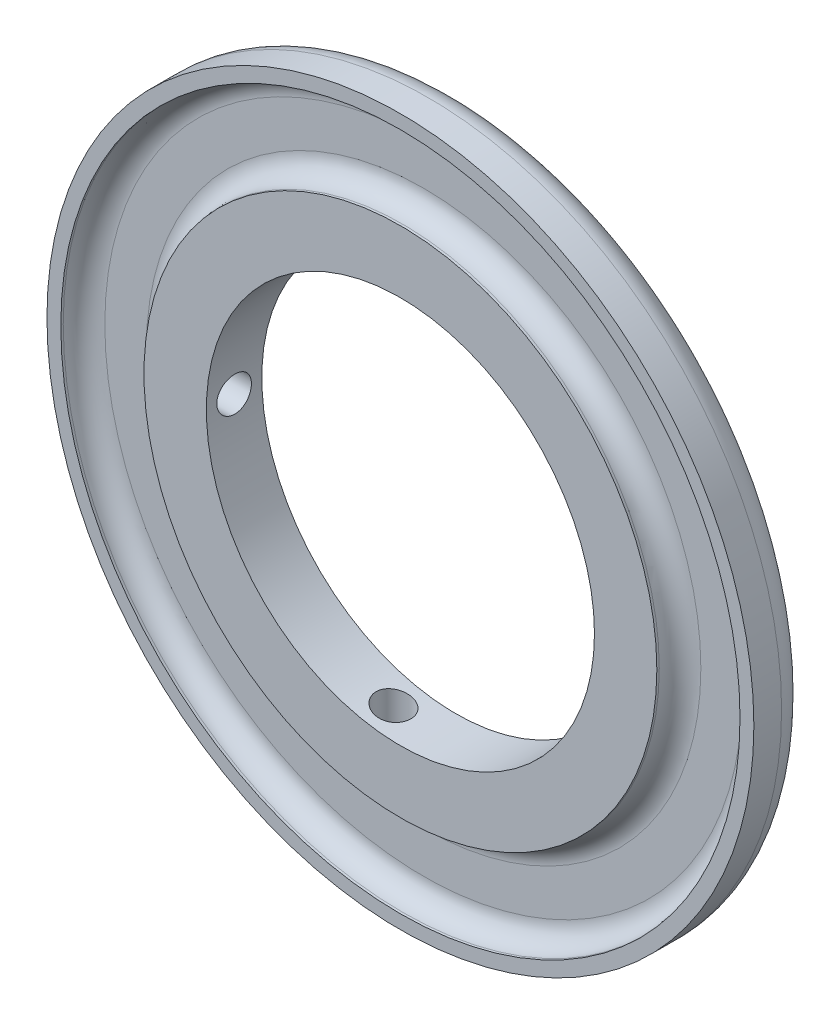
ISO-10303-21;
HEADER;
FILE_DESCRIPTION(('STEP AP214'),'2;1');
FILE_NAME('part.step','',(''),(''),'','','');
FILE_SCHEMA(('AUTOMOTIVE_DESIGN { 1 0 10303 214 1 1 1 1 }'));
ENDSEC;
DATA;
#1=APPLICATION_CONTEXT('core data for automotive mechanical design processes');
#2=APPLICATION_PROTOCOL_DEFINITION('international standard','automotive_design',2000,#1);
#3=PRODUCT_CONTEXT('',#1,'mechanical');
#4=PRODUCT('Part','Part','',(#3));
#5=PRODUCT_RELATED_PRODUCT_CATEGORY('part','',(#4));
#6=PRODUCT_DEFINITION_FORMATION('','',#4);
#7=PRODUCT_DEFINITION_CONTEXT('part definition',#1,'design');
#8=PRODUCT_DEFINITION('design','',#6,#7);
#9=PRODUCT_DEFINITION_SHAPE('','',#8);
#10=(LENGTH_UNIT() NAMED_UNIT(*) SI_UNIT(.MILLI.,.METRE.));
#11=(NAMED_UNIT(*) PLANE_ANGLE_UNIT() SI_UNIT($,.RADIAN.));
#12=(NAMED_UNIT(*) SI_UNIT($,.STERADIAN.) SOLID_ANGLE_UNIT());
#13=UNCERTAINTY_MEASURE_WITH_UNIT(LENGTH_MEASURE(1.E-05),#10,'distance_accuracy_value','');
#14=(GEOMETRIC_REPRESENTATION_CONTEXT(3) GLOBAL_UNCERTAINTY_ASSIGNED_CONTEXT((#13)) GLOBAL_UNIT_ASSIGNED_CONTEXT((#10,
#11,#12)) REPRESENTATION_CONTEXT('',''));
#15=CARTESIAN_POINT('',(0.,0.,0.));
#16=DIRECTION('',(0.,0.,1.));
#17=DIRECTION('',(1.,0.,0.));
#18=AXIS2_PLACEMENT_3D('',#15,#16,#17);
#19=CARTESIAN_POINT('',(0.,0.,4.));
#20=DIRECTION('',(0.,0.,-1.));
#21=DIRECTION('',(-1.,0.,0.));
#22=AXIS2_PLACEMENT_3D('',#19,#20,#21);
#23=CYLINDRICAL_SURFACE('',#22,25.5);
#24=CARTESIAN_POINT('',(0.,0.,2.));
#25=DIRECTION('',(0.,0.,1.));
#26=DIRECTION('',(1.,0.,0.));
#27=AXIS2_PLACEMENT_3D('',#24,#25,#26);
#28=CIRCLE('',#27,25.5);
#29=CARTESIAN_POINT('',(25.5,0.,2.));
#30=VERTEX_POINT('',#29);
#31=EDGE_CURVE('E45',#30,#30,#28,.T.);
#32=ORIENTED_EDGE('',*,*,#31,.T.);
#33=EDGE_LOOP('',(#32));
#34=FACE_BOUND('',#33,.T.);
#35=CARTESIAN_POINT('',(0.,0.,4.));
#36=DIRECTION('',(0.,0.,1.));
#37=DIRECTION('',(1.,0.,0.));
#38=AXIS2_PLACEMENT_3D('',#35,#36,#37);
#39=CIRCLE('',#38,25.5);
#40=CARTESIAN_POINT('',(25.5,0.,4.));
#41=VERTEX_POINT('',#40);
#42=EDGE_CURVE('E131',#41,#41,#39,.T.);
#43=ORIENTED_EDGE('',*,*,#42,.F.);
#44=EDGE_LOOP('',(#43));
#45=FACE_BOUND('',#44,.T.);
#46=ADVANCED_FACE('F32',(#34,#45),#23,.T.);
#47=CARTESIAN_POINT('',(0.,0.,4.));
#48=DIRECTION('',(0.,0.,1.));
#49=DIRECTION('',(1.,0.,0.));
#50=AXIS2_PLACEMENT_3D('',#47,#48,#49);
#51=PLANE('',#50);
#52=CARTESIAN_POINT('',(0.,0.,4.));
#53=DIRECTION('',(0.,0.,1.));
#54=DIRECTION('',(1.,0.,0.));
#55=AXIS2_PLACEMENT_3D('',#52,#53,#54);
#56=CIRCLE('',#55,24.5);
#57=CARTESIAN_POINT('',(24.5,0.,4.));
#58=VERTEX_POINT('',#57);
#59=EDGE_CURVE('E142',#58,#58,#56,.T.);
#60=ORIENTED_EDGE('',*,*,#59,.F.);
#61=EDGE_LOOP('',(#60));
#62=FACE_BOUND('',#61,.T.);
#63=ORIENTED_EDGE('',*,*,#42,.T.);
#64=EDGE_LOOP('',(#63));
#65=FACE_BOUND('',#64,.T.);
#66=ADVANCED_FACE('F95',(#62,#65),#51,.T.);
#67=CARTESIAN_POINT('',(0.,0.,0.));
#68=DIRECTION('',(0.,0.,1.));
#69=DIRECTION('',(1.,0.,0.));
#70=AXIS2_PLACEMENT_3D('',#67,#68,#69);
#71=PLANE('',#70);
#72=CARTESIAN_POINT('',(0.,0.,0.));
#73=DIRECTION('',(0.,0.,1.));
#74=DIRECTION('',(1.,0.,0.));
#75=AXIS2_PLACEMENT_3D('',#72,#73,#74);
#76=CIRCLE('',#75,23.5);
#77=CARTESIAN_POINT('',(23.5,0.,0.));
#78=VERTEX_POINT('',#77);
#79=EDGE_CURVE('E10',#78,#78,#76,.F.);
#80=ORIENTED_EDGE('',*,*,#79,.T.);
#81=EDGE_LOOP('',(#80));
#82=FACE_BOUND('',#81,.T.);
#83=CARTESIAN_POINT('',(0.,0.,0.));
#84=DIRECTION('',(0.,0.,1.));
#85=DIRECTION('',(1.,0.,0.));
#86=AXIS2_PLACEMENT_3D('',#83,#84,#85);
#87=CIRCLE('',#86,14.);
#88=CARTESIAN_POINT('',(14.,0.,0.));
#89=VERTEX_POINT('',#88);
#90=EDGE_CURVE('E147',#89,#89,#87,.T.);
#91=ORIENTED_EDGE('',*,*,#90,.T.);
#92=EDGE_LOOP('',(#91));
#93=FACE_BOUND('',#92,.T.);
#94=ADVANCED_FACE('F101',(#82,#93),#71,.F.);
#95=CARTESIAN_POINT('',(0.,0.,2.325));
#96=DIRECTION('',(0.,0.,1.));
#97=DIRECTION('',(1.,0.,0.));
#98=AXIS2_PLACEMENT_3D('',#95,#96,#97);
#99=CYLINDRICAL_SURFACE('',#98,24.5);
#100=CARTESIAN_POINT('',(0.,0.,3.825));
#101=DIRECTION('',(0.,0.,1.));
#102=DIRECTION('',(1.,0.,0.));
#103=AXIS2_PLACEMENT_3D('',#100,#101,#102);
#104=CIRCLE('',#103,24.5);
#105=CARTESIAN_POINT('',(24.5,0.,3.825));
#106=VERTEX_POINT('',#105);
#107=EDGE_CURVE('E50',#106,#106,#104,.F.);
#108=ORIENTED_EDGE('',*,*,#107,.T.);
#109=EDGE_LOOP('',(#108));
#110=FACE_BOUND('',#109,.T.);
#111=ORIENTED_EDGE('',*,*,#59,.T.);
#112=EDGE_LOOP('',(#111));
#113=FACE_BOUND('',#112,.T.);
#114=ADVANCED_FACE('F135',(#110,#113),#99,.F.);
#115=CARTESIAN_POINT('',(0.,0.,2.325));
#116=DIRECTION('',(0.,0.,1.));
#117=DIRECTION('',(1.,0.,0.));
#118=AXIS2_PLACEMENT_3D('',#115,#116,#117);
#119=PLANE('',#118);
#120=CARTESIAN_POINT('',(0.,0.,2.325));
#121=DIRECTION('',(0.,0.,1.));
#122=DIRECTION('',(1.,0.,0.));
#123=AXIS2_PLACEMENT_3D('',#120,#121,#122);
#124=CIRCLE('',#123,20.);
#125=CARTESIAN_POINT('',(20.,0.,2.325));
#126=VERTEX_POINT('',#125);
#127=EDGE_CURVE('E125',#126,#126,#124,.F.);
#128=ORIENTED_EDGE('',*,*,#127,.T.);
#129=EDGE_LOOP('',(#128));
#130=FACE_BOUND('',#129,.T.);
#131=CARTESIAN_POINT('',(0.,0.,2.325));
#132=DIRECTION('',(0.,0.,1.));
#133=DIRECTION('',(1.,0.,0.));
#134=AXIS2_PLACEMENT_3D('',#131,#132,#133);
#135=CIRCLE('',#134,23.);
#136=CARTESIAN_POINT('',(23.,0.,2.325));
#137=VERTEX_POINT('',#136);
#138=EDGE_CURVE('E123',#137,#137,#135,.T.);
#139=ORIENTED_EDGE('',*,*,#138,.T.);
#140=EDGE_LOOP('',(#139));
#141=FACE_BOUND('',#140,.T.);
#142=ADVANCED_FACE('F138',(#130,#141),#119,.T.);
#143=CARTESIAN_POINT('',(0.,0.,2.325));
#144=DIRECTION('',(0.,0.,1.));
#145=DIRECTION('',(1.,0.,0.));
#146=AXIS2_PLACEMENT_3D('',#143,#144,#145);
#147=CYLINDRICAL_SURFACE('',#146,18.5);
#148=CARTESIAN_POINT('',(0.,0.,3.825));
#149=DIRECTION('',(0.,0.,1.));
#150=DIRECTION('',(1.,0.,0.));
#151=AXIS2_PLACEMENT_3D('',#148,#149,#150);
#152=CIRCLE('',#151,18.5);
#153=CARTESIAN_POINT('',(18.5,0.,3.825));
#154=VERTEX_POINT('',#153);
#155=EDGE_CURVE('E126',#154,#154,#152,.T.);
#156=ORIENTED_EDGE('',*,*,#155,.T.);
#157=EDGE_LOOP('',(#156));
#158=FACE_BOUND('',#157,.T.);
#159=CARTESIAN_POINT('',(0.,0.,4.));
#160=DIRECTION('',(0.,0.,1.));
#161=DIRECTION('',(1.,0.,0.));
#162=AXIS2_PLACEMENT_3D('',#159,#160,#161);
#163=CIRCLE('',#162,18.5);
#164=CARTESIAN_POINT('',(18.5,0.,4.));
#165=VERTEX_POINT('',#164);
#166=EDGE_CURVE('E143',#165,#165,#163,.T.);
#167=ORIENTED_EDGE('',*,*,#166,.F.);
#168=EDGE_LOOP('',(#167));
#169=FACE_BOUND('',#168,.T.);
#170=ADVANCED_FACE('F176',(#158,#169),#147,.T.);
#171=CARTESIAN_POINT('',(0.,0.,4.));
#172=DIRECTION('',(0.,0.,1.));
#173=DIRECTION('',(1.,0.,0.));
#174=AXIS2_PLACEMENT_3D('',#171,#172,#173);
#175=CIRCLE('',#174,14.);
#176=CARTESIAN_POINT('',(14.,0.,4.));
#177=VERTEX_POINT('',#176);
#178=EDGE_CURVE('E60',#177,#177,#175,.T.);
#179=ORIENTED_EDGE('',*,*,#178,.F.);
#180=EDGE_LOOP('',(#179));
#181=FACE_BOUND('',#180,.T.);
#182=ORIENTED_EDGE('',*,*,#166,.T.);
#183=EDGE_LOOP('',(#182));
#184=FACE_BOUND('',#183,.T.);
#185=ADVANCED_FACE('F104',(#181,#184),#51,.T.);
#186=CARTESIAN_POINT('',(0.,0.,3.825));
#187=DIRECTION('',(0.,0.,1.));
#188=DIRECTION('',(1.,0.,0.));
#189=AXIS2_PLACEMENT_3D('',#186,#187,#188);
#190=TOROIDAL_SURFACE('',#189,20.,1.5);
#191=ORIENTED_EDGE('',*,*,#127,.F.);
#192=EDGE_LOOP('',(#191));
#193=FACE_BOUND('',#192,.T.);
#194=ORIENTED_EDGE('',*,*,#155,.F.);
#195=EDGE_LOOP('',(#194));
#196=FACE_BOUND('',#195,.T.);
#197=ADVANCED_FACE('F108',(#193,#196),#190,.F.);
#198=CARTESIAN_POINT('',(0.,0.,3.825));
#199=DIRECTION('',(0.,0.,1.));
#200=DIRECTION('',(1.,0.,0.));
#201=AXIS2_PLACEMENT_3D('',#198,#199,#200);
#202=TOROIDAL_SURFACE('',#201,23.,1.5);
#203=ORIENTED_EDGE('',*,*,#107,.F.);
#204=EDGE_LOOP('',(#203));
#205=FACE_BOUND('',#204,.T.);
#206=ORIENTED_EDGE('',*,*,#138,.F.);
#207=EDGE_LOOP('',(#206));
#208=FACE_BOUND('',#207,.T.);
#209=ADVANCED_FACE('F110',(#205,#208),#202,.F.);
#210=CARTESIAN_POINT('',(0.,0.,0.));
#211=DIRECTION('',(0.,0.,1.));
#212=DIRECTION('',(1.,0.,0.));
#213=AXIS2_PLACEMENT_3D('',#210,#211,#212);
#214=CYLINDRICAL_SURFACE('',#213,14.);
#215=CARTESIAN_POINT('',(-2.5,-13.7749773139559,3.25));
#216=CARTESIAN_POINT('',(-2.57164259935507,-13.7619741670579,3.24999689458408));
#217=CARTESIAN_POINT('',(-2.64323529159304,-13.748398191689,3.24382114221399));
#218=CARTESIAN_POINT('',(-2.78424483267168,-13.7205380735551,3.21935988425997));
#219=CARTESIAN_POINT('',(-2.85365868705329,-13.7062530203455,3.20105841682243));
#220=CARTESIAN_POINT('',(-2.98827381311458,-13.6775346041912,3.15290625387002));
#221=CARTESIAN_POINT('',(-3.05347805680443,-13.6631013544063,3.1230638127451));
#222=CARTESIAN_POINT('',(-3.17789855895773,-13.6346997561206,3.0526456416841));
#223=CARTESIAN_POINT('',(-3.2371162863401,-13.6207312941413,3.01207255361901));
#224=CARTESIAN_POINT('',(-3.34798505006383,-13.5939052166115,2.92117698106083));
#225=CARTESIAN_POINT('',(-3.39962437744961,-13.5810493323565,2.87083968329783));
#226=CARTESIAN_POINT('',(-3.49366298959426,-13.5571633810853,2.76178487427188));
#227=CARTESIAN_POINT('',(-3.53606281605291,-13.5461332070394,2.7030678546352));
#228=CARTESIAN_POINT('',(-3.60948027470639,-13.5267538628513,2.58014958918348));
#229=CARTESIAN_POINT('',(-3.64071183093684,-13.5183547356155,2.5160841452821));
#230=CARTESIAN_POINT('',(-3.69190483097585,-13.5044640088896,2.38330426355143));
#231=CARTESIAN_POINT('',(-3.71186887302075,-13.4989717391098,2.31459090160638));
#232=CARTESIAN_POINT('',(-3.73934219718193,-13.4913867935782,2.17690657177338));
#233=CARTESIAN_POINT('',(-3.74724102782776,-13.4891878353235,2.10801905526296));
#234=CARTESIAN_POINT('',(-3.75154556808647,-13.4879914020696,1.96986257605561));
#235=CARTESIAN_POINT('',(-3.74795283596805,-13.4889934930044,1.90059366634759));
#236=CARTESIAN_POINT('',(-3.72958355053519,-13.494083606318,1.76501867330509));
#237=CARTESIAN_POINT('',(-3.7150199743854,-13.4981128584417,1.69868132642959));
#238=CARTESIAN_POINT('',(-3.67545159071499,-13.5089404805265,1.56944047570535));
#239=CARTESIAN_POINT('',(-3.6504463502112,-13.5157389653187,1.50653711437559));
#240=CARTESIAN_POINT('',(-3.5904524226677,-13.5318003862406,1.38514286310552));
#241=CARTESIAN_POINT('',(-3.55535471832887,-13.5410901546888,1.32670949318962));
#242=CARTESIAN_POINT('',(-3.47634891151721,-13.5615876477639,1.2165199823124));
#243=CARTESIAN_POINT('',(-3.43243946887382,-13.5727956640976,1.16476485901013));
#244=CARTESIAN_POINT('',(-3.33553918153944,-13.5969387288645,1.0676786665381));
#245=CARTESIAN_POINT('',(-3.28230774642456,-13.6099167493773,1.0225983990601));
#246=CARTESIAN_POINT('',(-3.16924210740953,-13.6366886260348,0.941964787287049));
#247=CARTESIAN_POINT('',(-3.10940687888276,-13.6504826086273,0.9064129243354));
#248=CARTESIAN_POINT('',(-2.98304203191848,-13.6786606064554,0.844907739937328));
#249=CARTESIAN_POINT('',(-2.91637612037933,-13.6930505331652,0.819236731072047));
#250=CARTESIAN_POINT('',(-2.77957764226134,-13.7214731857315,0.779586815534889));
#251=CARTESIAN_POINT('',(-2.70944490697754,-13.7355058941544,0.765608478454188));
#252=CARTESIAN_POINT('',(-2.56725513208876,-13.7627929047418,0.749751258028876));
#253=CARTESIAN_POINT('',(-2.49518948835116,-13.7760423852215,0.747940865215139));
#254=CARTESIAN_POINT('',(-2.35159783514292,-13.8012789611474,0.756758376173244));
#255=CARTESIAN_POINT('',(-2.28007179126558,-13.8132661377249,0.767385480025423));
#256=CARTESIAN_POINT('',(-2.14057022753826,-13.8355661131838,0.800671851813134));
#257=CARTESIAN_POINT('',(-2.07256151095795,-13.8458979618678,0.823179119134103));
#258=CARTESIAN_POINT('',(-1.94119420735525,-13.8649260070215,0.879578573863381));
#259=CARTESIAN_POINT('',(-1.87783520849906,-13.8736223484578,0.913469751491896));
#260=CARTESIAN_POINT('',(-1.75867334926159,-13.8892270410008,0.991084621066825));
#261=CARTESIAN_POINT('',(-1.70276591358996,-13.8961617455603,1.03464252001676));
#262=CARTESIAN_POINT('',(-1.59901901397975,-13.9084820445684,1.1306734287483));
#263=CARTESIAN_POINT('',(-1.55117911755493,-13.9138677220685,1.18314596032957));
#264=CARTESIAN_POINT('',(-1.46542710093282,-13.9231595433388,1.29496391279585));
#265=CARTESIAN_POINT('',(-1.42742404467742,-13.9270794001437,1.35423848454516));
#266=CARTESIAN_POINT('',(-1.36187241102837,-13.9336425088142,1.47837561556677));
#267=CARTESIAN_POINT('',(-1.33432362029971,-13.9362857867306,1.54323806077696));
#268=CARTESIAN_POINT('',(-1.29056245051011,-13.9404065044611,1.67648386554763));
#269=CARTESIAN_POINT('',(-1.27431401692733,-13.9418876540776,1.74485527279057));
#270=CARTESIAN_POINT('',(-1.25348420640783,-13.9437759770702,1.88336740749282));
#271=CARTESIAN_POINT('',(-1.24890280151511,-13.9441831530196,1.95350813071216));
#272=CARTESIAN_POINT('',(-1.25153974997768,-13.9439467062404,2.09352975643444));
#273=CARTESIAN_POINT('',(-1.25875210593966,-13.9433036175951,2.16341077289421));
#274=CARTESIAN_POINT('',(-1.28475548869485,-13.9409315184521,2.30096521957514));
#275=CARTESIAN_POINT('',(-1.30354650470884,-13.9392025089653,2.36863865185141));
#276=CARTESIAN_POINT('',(-1.35215984377264,-13.934570536507,2.49985848426954));
#277=CARTESIAN_POINT('',(-1.38198236352005,-13.9316675526029,2.56340481079916));
#278=CARTESIAN_POINT('',(-1.45178398410745,-13.92456636902,2.68456624789903));
#279=CARTESIAN_POINT('',(-1.49176263241978,-13.920368227048,2.74218162257464));
#280=CARTESIAN_POINT('',(-1.58072098017258,-13.9105470371999,2.84988639650536));
#281=CARTESIAN_POINT('',(-1.62970461907014,-13.9049233652807,2.8999724843869));
#282=CARTESIAN_POINT('',(-1.73523270023587,-13.8921483660177,2.9912096935659));
#283=CARTESIAN_POINT('',(-1.79177890896527,-13.8849966815274,3.03235872143921));
#284=CARTESIAN_POINT('',(-1.91098208041106,-13.8690942077049,3.10473534138319));
#285=CARTESIAN_POINT('',(-1.9736612081715,-13.8603375100977,3.13592506863351));
#286=CARTESIAN_POINT('',(-2.10308513769015,-13.8412895047084,3.18734906610438));
#287=CARTESIAN_POINT('',(-2.16982547134408,-13.8309998660231,3.20759514238041));
#288=CARTESIAN_POINT('',(-2.28079677930859,-13.8130333304385,3.23142374821248));
#289=CARTESIAN_POINT('',(-2.32439837087724,-13.8057649819124,3.23838779104464));
#290=CARTESIAN_POINT('',(-2.4120062468529,-13.7907288406226,3.24767686508402));
#291=CARTESIAN_POINT('',(-2.45601253035356,-13.7829610489772,3.25000190667828));
#292=CARTESIAN_POINT('',(-2.5,-13.7749773139559,3.25));
#293=B_SPLINE_CURVE_WITH_KNOTS('',3,(#215,#216,#217,#218,#219,#220,#221,#222,#223,#224,#225,
#226,#227,#228,#229,#230,#231,#232,#233,#234,#235,#236,#237,#238,#239,#240,#241,#242,#243,#244,
#245,#246,#247,#248,#249,#250,#251,#252,#253,#254,#255,#256,#257,#258,#259,#260,#261,#262,#263,
#264,#265,#266,#267,#268,#269,#270,#271,#272,#273,#274,#275,#276,#277,#278,#279,#280,#281,#282,
#283,#284,#285,#286,#287,#288,#289,#290,#291,#292),.UNSPECIFIED.,.T.,.F.,(4,2,2,2,2,2,2,2,2,2,2,
2,2,2,2,2,2,2,2,2,2,2,2,2,2,2,2,2,2,2,2,2,2,2,2,2,2,2,4),(0.,0.218274632587351,
0.436837166409063,0.655243667141908,0.87359644645959,1.09228311658139,1.31095696194018,
1.52518407551779,1.7393617691154,1.94646616980056,2.15354248808903,2.35669921767997,
2.55986437238189,2.76531229395023,2.97079148564938,3.18268143008122,3.39460429712201,
3.6121981649306,3.82980263188477,4.04863092548177,4.26744514587409,4.48352529027836,
4.69958627292157,4.912194305089,5.12479093609688,5.33534573490288,5.54589623679053,
5.75577184311063,5.96564694653588,6.17541535692525,6.38518357203003,6.59495552759444,
6.80471813796717,7.01457273353413,7.22447643272101,7.43516892815537,7.64563367170688,
7.77965128636776,7.91366860095372),.UNSPECIFIED.);
#294=CARTESIAN_POINT('',(-2.5,-13.7749773139559,3.25));
#295=VERTEX_POINT('',#294);
#296=EDGE_CURVE('E36',#295,#295,#293,.T.);
#297=ORIENTED_EDGE('',*,*,#296,.T.);
#298=EDGE_LOOP('',(#297));
#299=FACE_BOUND('',#298,.T.);
#300=CARTESIAN_POINT('',(-2.5,13.7749773139559,3.25));
#301=CARTESIAN_POINT('',(-2.42980879102017,13.7877154970174,3.24999720761621));
#302=CARTESIAN_POINT('',(-2.35947645055878,13.7999208497583,3.24407010817171));
#303=CARTESIAN_POINT('',(-2.22054379913938,13.8229576123905,3.22040083316128));
#304=CARTESIAN_POINT('',(-2.15194517394493,13.8337877233553,3.20264758509192));
#305=CARTESIAN_POINT('',(-2.01850649109439,13.8538870239048,3.15570980073195));
#306=CARTESIAN_POINT('',(-1.95366722971256,13.8631558835858,3.12652285274001));
#307=CARTESIAN_POINT('',(-1.82972449900621,13.8800585485119,3.05747905075269));
#308=CARTESIAN_POINT('',(-1.77061972500638,13.8876927261491,3.0176246315473));
#309=CARTESIAN_POINT('',(-1.66050348324122,13.9012869912358,2.92881472166671));
#310=CARTESIAN_POINT('',(-1.60941420940135,13.907263669794,2.87995823396699));
#311=CARTESIAN_POINT('',(-1.51612705072769,13.9177429220828,2.77424986434691));
#312=CARTESIAN_POINT('',(-1.47392909722574,13.922245507198,2.71739804418061));
#313=CARTESIAN_POINT('',(-1.39996481994285,13.9298771003685,2.59777235865029));
#314=CARTESIAN_POINT('',(-1.36812392872914,13.9330159842398,2.53504521187817));
#315=CARTESIAN_POINT('',(-1.31538679854151,13.938093971816,2.40510235597273));
#316=CARTESIAN_POINT('',(-1.29449039192973,13.9400330938979,2.33788671560794));
#317=CARTESIAN_POINT('',(-1.26428512035948,13.9428051380456,2.20102238629908));
#318=CARTESIAN_POINT('',(-1.25495281287927,13.9436402982721,2.1313789148262));
#319=CARTESIAN_POINT('',(-1.24806923259462,13.9442581640958,1.99150759627698));
#320=CARTESIAN_POINT('',(-1.25051791587498,13.9440408736162,1.92127975137993));
#321=CARTESIAN_POINT('',(-1.26712317785695,13.9425416226996,1.7822505861937));
#322=CARTESIAN_POINT('',(-1.28127700462898,13.9412599125121,1.71344893449733));
#323=CARTESIAN_POINT('',(-1.32087685566651,13.9375635076804,1.57920822761936));
#324=CARTESIAN_POINT('',(-1.34632283927529,13.9351488171156,1.51376916033192));
#325=CARTESIAN_POINT('',(-1.4077653771933,13.9290755233412,1.38810504514092));
#326=CARTESIAN_POINT('',(-1.44376260370624,13.9254168408763,1.32788032975257));
#327=CARTESIAN_POINT('',(-1.52524972183024,13.9167268592136,1.21435114740934));
#328=CARTESIAN_POINT('',(-1.57073954160524,13.9116955704028,1.1610466280902));
#329=CARTESIAN_POINT('',(-1.66992404346124,13.9001382331875,1.0627958946332));
#330=CARTESIAN_POINT('',(-1.72362706660292,13.8936106618072,1.01785828170416));
#331=CARTESIAN_POINT('',(-1.83762328303179,13.8789926722359,0.937637024345333));
#332=CARTESIAN_POINT('',(-1.89791654264272,13.8709022383157,0.902353477086005));
#333=CARTESIAN_POINT('',(-2.02364295330943,13.8531193164291,0.842216144137367));
#334=CARTESIAN_POINT('',(-2.08909965342247,13.8434192358183,0.817413864593702));
#335=CARTESIAN_POINT('',(-2.2230090045453,13.8225475631616,0.779087539257626));
#336=CARTESIAN_POINT('',(-2.29146182394761,13.8113758883357,0.765564128236487));
#337=CARTESIAN_POINT('',(-2.4302652292077,13.7876330481805,0.749971172085932));
#338=CARTESIAN_POINT('',(-2.50062869392805,13.7750468567167,0.748039367647944));
#339=CARTESIAN_POINT('',(-2.64051143305614,13.7489186678079,0.755947919070465));
#340=CARTESIAN_POINT('',(-2.71003062154459,13.7353765740233,0.765789463092515));
#341=CARTESIAN_POINT('',(-2.84746974718681,13.7075494903743,0.797164243506874));
#342=CARTESIAN_POINT('',(-2.91534494660543,13.6932559738057,0.818886025620985));
#343=CARTESIAN_POINT('',(-3.04643912991601,13.6646885876249,0.873524021566138));
#344=CARTESIAN_POINT('',(-3.10965769764071,13.6504147198803,0.906441234469509));
#345=CARTESIAN_POINT('',(-3.23023725719196,13.6223873426215,0.982947028039356));
#346=CARTESIAN_POINT('',(-3.28754067078421,13.608639643563,1.02662860901087));
#347=CARTESIAN_POINT('',(-3.39396853288334,13.5824882249666,1.12336414828729));
#348=CARTESIAN_POINT('',(-3.44309328556988,13.5700844554514,1.17641775787767));
#349=CARTESIAN_POINT('',(-3.53110620286369,13.5474475422639,1.28978396704127));
#350=CARTESIAN_POINT('',(-3.57011094058768,13.5371899701584,1.35000105706284));
#351=CARTESIAN_POINT('',(-3.63736572159193,13.5192746948734,1.4765225745716));
#352=CARTESIAN_POINT('',(-3.66561799809967,13.5116164518631,1.54282573446074));
#353=CARTESIAN_POINT('',(-3.70966968151189,13.499587370758,1.67742210622464));
#354=CARTESIAN_POINT('',(-3.7258302424527,13.4951213872493,1.74558861386618));
#355=CARTESIAN_POINT('',(-3.74654520021985,13.4893853760933,1.88379072924453));
#356=CARTESIAN_POINT('',(-3.75110175586409,13.4881147539791,1.95382598686746));
#357=CARTESIAN_POINT('',(-3.74848318355314,13.4888425587154,2.09176552464122));
#358=CARTESIAN_POINT('',(-3.74162037991865,13.4907539566605,2.15967644428601));
#359=CARTESIAN_POINT('',(-3.71699358139517,13.4975597696035,2.29333281526742));
#360=CARTESIAN_POINT('',(-3.69922975645705,13.5024541380958,2.35907830034712));
#361=CARTESIAN_POINT('',(-3.65338418622262,13.5149304171481,2.486621196234));
#362=CARTESIAN_POINT('',(-3.62529767467346,13.5225135691323,2.54841676776614));
#363=CARTESIAN_POINT('',(-3.55968889678062,13.5399321439504,2.66642218568807));
#364=CARTESIAN_POINT('',(-3.52216579894241,13.5497677652515,2.7226315392451));
#365=CARTESIAN_POINT('',(-3.43765930880519,13.5714570505672,2.82949240492964));
#366=CARTESIAN_POINT('',(-3.39045089517694,13.5833574206744,2.87995639018935));
#367=CARTESIAN_POINT('',(-3.28855332590167,13.608385859438,2.97232458930267));
#368=CARTESIAN_POINT('',(-3.23386127090884,13.6215144032923,3.01422546983418));
#369=CARTESIAN_POINT('',(-3.11664380011323,13.6488190858699,3.08961406080195));
#370=CARTESIAN_POINT('',(-3.0539259347951,13.663015195367,3.12279526374893));
#371=CARTESIAN_POINT('',(-2.92384167592916,13.6914413779711,3.17806772914877));
#372=CARTESIAN_POINT('',(-2.85647988241744,13.7056714043639,3.20016979146883));
#373=CARTESIAN_POINT('',(-2.74068943646279,13.7292001357913,3.22756226070761));
#374=CARTESIAN_POINT('',(-2.69300022456579,13.7386369006569,3.23595762519381));
#375=CARTESIAN_POINT('',(-2.59689645462026,13.757126284307,3.24717747290324));
#376=CARTESIAN_POINT('',(-2.54848189300609,13.7661789012023,3.2500019287323));
#377=CARTESIAN_POINT('',(-2.5,13.7749773139559,3.25));
#378=B_SPLINE_CURVE_WITH_KNOTS('',3,(#300,#301,#302,#303,#304,#305,#306,#307,#308,#309,#310,
#311,#312,#313,#314,#315,#316,#317,#318,#319,#320,#321,#322,#323,#324,#325,#326,#327,#328,#329,
#330,#331,#332,#333,#334,#335,#336,#337,#338,#339,#340,#341,#342,#343,#344,#345,#346,#347,#348,
#349,#350,#351,#352,#353,#354,#355,#356,#357,#358,#359,#360,#361,#362,#363,#364,#365,#366,#367,
#368,#369,#370,#371,#372,#373,#374,#375,#376,#377),.UNSPECIFIED.,.T.,.F.,(4,2,2,2,2,2,2,2,2,2,2,
2,2,2,2,2,2,2,2,2,2,2,2,2,2,2,2,2,2,2,2,2,2,2,2,2,2,2,4),(0.,0.213837643151146,0.42787577863851,
0.641959085351482,0.855993570366136,1.06780120918661,1.27960721214484,1.48985267158702,
1.70009491058244,1.90991024955237,2.11972480640855,2.32949004897868,2.53925453630778,
2.74903239032038,2.95880865687784,3.16879939765681,3.37879225196451,3.58980536201565,
3.80083034701889,4.01435801028264,4.22790722448939,4.44494829548845,4.66200874016348,
4.8810146384417,5.10001238966175,5.31636262170786,5.5326678944382,5.74222188492431,
5.95173688697898,6.15561522044755,6.35949037545968,6.56345978343554,6.76744717025443,
6.97685863590698,7.1863514636189,7.40244173240164,7.61832094630309,7.76602039339076,
7.91372056676873),.UNSPECIFIED.);
#379=CARTESIAN_POINT('',(-2.5,13.7749773139559,3.25));
#380=VERTEX_POINT('',#379);
#381=EDGE_CURVE('E62',#380,#380,#378,.T.);
#382=ORIENTED_EDGE('',*,*,#381,.T.);
#383=EDGE_LOOP('',(#382));
#384=FACE_BOUND('',#383,.T.);
#385=CARTESIAN_POINT('',(-14.,0.,0.75));
#386=CARTESIAN_POINT('',(-13.9999992726845,-0.0700633726975435,0.750003051780729));
#387=CARTESIAN_POINT('',(-13.9994684482046,-0.140173979924318,0.755910472080238));
#388=CARTESIAN_POINT('',(-13.9974019232811,-0.278454056761478,0.779388616119558));
#389=CARTESIAN_POINT('',(-13.9958650949556,-0.34662125789764,0.796972431177113));
#390=CARTESIAN_POINT('',(-13.9919601679808,-0.478991879046346,0.843289669812852));
#391=CARTESIAN_POINT('',(-13.9895925504493,-0.543197567957667,0.872016641298022));
#392=CARTESIAN_POINT('',(-13.9842912997852,-0.665860880351151,0.939792857764617));
#393=CARTESIAN_POINT('',(-13.9813577848868,-0.72431970069467,0.978839947170185));
#394=CARTESIAN_POINT('',(-13.9752442048959,-0.83401442010833,1.06627008175556));
#395=CARTESIAN_POINT('',(-13.9720635240972,-0.885231323097645,1.11467691957584));
#396=CARTESIAN_POINT('',(-13.9658192353393,-0.978825254882229,1.21940199162361));
#397=CARTESIAN_POINT('',(-13.9627556326176,-1.02120188858844,1.27572057925463));
#398=CARTESIAN_POINT('',(-13.9570858820707,-1.09597779597692,1.39478696251659));
#399=CARTESIAN_POINT('',(-13.9544805114089,-1.12836018825486,1.45754540016207));
#400=CARTESIAN_POINT('',(-13.9500294937957,-1.18212057888811,1.58763596539892));
#401=CARTESIAN_POINT('',(-13.9481838316338,-1.20349879756664,1.65496800138812));
#402=CARTESIAN_POINT('',(-13.945466532868,-1.23458843032386,1.79210279431008));
#403=CARTESIAN_POINT('',(-13.9445922947997,-1.24433100980092,1.86189843337997));
#404=CARTESIAN_POINT('',(-13.9439086640955,-1.25196910735176,2.00213934719285));
#405=CARTESIAN_POINT('',(-13.9440992487876,-1.24986487766523,2.07258460807235));
#406=CARTESIAN_POINT('',(-13.9455213612203,-1.23389482079625,2.21191108636971));
#407=CARTESIAN_POINT('',(-13.9467498865968,-1.22006291686527,2.28079622711822));
#408=CARTESIAN_POINT('',(-13.9501047546453,-1.18108287891883,2.41526330150839));
#409=CARTESIAN_POINT('',(-13.9522311072211,-1.15593462007346,2.48084519870333));
#410=CARTESIAN_POINT('',(-13.9571455000755,-1.09499793790618,2.60695194677138));
#411=CARTESIAN_POINT('',(-13.9599344821472,-1.05919435173607,2.66746943253616));
#412=CARTESIAN_POINT('',(-13.9658590433452,-0.977974265658174,2.78164892850803));
#413=CARTESIAN_POINT('',(-13.9689946305427,-0.932557541871884,2.83531077900886));
#414=CARTESIAN_POINT('',(-13.9752724662487,-0.83321039647635,2.93445294739779));
#415=CARTESIAN_POINT('',(-13.9784146995199,-0.779250657897878,2.97990389384991));
#416=CARTESIAN_POINT('',(-13.9843413270906,-0.664451319143282,3.06110678752527));
#417=CARTESIAN_POINT('',(-13.9871257211018,-0.603611713424698,3.09685872693486));
#418=CARTESIAN_POINT('',(-13.9920235987145,-0.476760138433569,3.15764713062063));
#419=CARTESIAN_POINT('',(-13.9941369968706,-0.41074751175623,3.18268223034387));
#420=CARTESIAN_POINT('',(-13.997453822337,-0.275432793143501,3.22130541296478));
#421=CARTESIAN_POINT('',(-13.99865727133,-0.206130779631315,3.23489376862286));
#422=CARTESIAN_POINT('',(-14.0000158197691,-0.0664590263116809,3.25020076789093));
#423=CARTESIAN_POINT('',(-14.0001745011692,0.00390623545757359,3.25195996784399));
#424=CARTESIAN_POINT('',(-13.9994352149474,0.143930651579582,3.24366505503764));
#425=CARTESIAN_POINT('',(-13.9985372586637,0.213589813500959,3.23361106903808));
#426=CARTESIAN_POINT('',(-13.9957879549099,0.350108545334623,3.20200880541225));
#427=CARTESIAN_POINT('',(-13.9939381721791,0.41697251589562,3.18047939055023));
#428=CARTESIAN_POINT('',(-13.9894929183439,0.546139317256163,3.12655671598372));
#429=CARTESIAN_POINT('',(-13.9868974337722,0.608442065655376,3.09416326007489));
#430=CARTESIAN_POINT('',(-13.9812425861565,0.726902039393283,3.01933056688359));
#431=CARTESIAN_POINT('',(-13.9781819938519,0.783042279439181,2.97686453627147));
#432=CARTESIAN_POINT('',(-13.9719447051213,0.887412004416047,2.88313075553898));
#433=CARTESIAN_POINT('',(-13.9687680063795,0.935641331449502,2.83186282977937));
#434=CARTESIAN_POINT('',(-13.9626458747409,1.02295986579817,2.72180424822154));
#435=CARTESIAN_POINT('',(-13.9597011287629,1.0620225562068,2.66299251084226));
#436=CARTESIAN_POINT('',(-13.9543863136245,1.12971699590739,2.53962036772758));
#437=CARTESIAN_POINT('',(-13.9520162380036,1.15834886246803,2.4750600266311));
#438=CARTESIAN_POINT('',(-13.9481231339158,1.20432399210476,2.34211620445755));
#439=CARTESIAN_POINT('',(-13.9465988993985,1.22168333426033,2.27373832067546));
#440=CARTESIAN_POINT('',(-13.9445661308378,1.24467293865281,2.13502412264974));
#441=CARTESIAN_POINT('',(-13.9440575740691,1.25030346331563,2.06468785225963));
#442=CARTESIAN_POINT('',(-13.9441141271288,1.24967236986057,1.92431699851967));
#443=CARTESIAN_POINT('',(-13.944675475747,1.24345241167707,1.85428222260189));
#444=CARTESIAN_POINT('',(-13.9468005892922,1.21938394517745,1.71625639455222));
#445=CARTESIAN_POINT('',(-13.9483643556254,1.20153542054745,1.64826534528764));
#446=CARTESIAN_POINT('',(-13.9523171006433,1.15472735691656,1.51625531712157));
#447=CARTESIAN_POINT('',(-13.9547060113546,1.1257687331176,1.4522360115495));
#448=CARTESIAN_POINT('',(-13.9600400026984,1.05756701266295,1.32996062944912));
#449=CARTESIAN_POINT('',(-13.9629850765001,1.01832404231806,1.27170448215066));
#450=CARTESIAN_POINT('',(-13.9691119109184,0.930510961147366,1.16239571712976));
#451=CARTESIAN_POINT('',(-13.9722944345509,0.881909912506496,1.11136799586806));
#452=CARTESIAN_POINT('',(-13.9785305937513,0.776818586816023,1.01817223031202));
#453=CARTESIAN_POINT('',(-13.9815841980567,0.72032641034475,0.976006325225747));
#454=CARTESIAN_POINT('',(-13.987224786076,0.600932085927406,0.901665704030277));
#455=CARTESIAN_POINT('',(-13.9898107864881,0.538016855833662,0.869511941837332));
#456=CARTESIAN_POINT('',(-13.9942135989732,0.407699399242664,0.816266637576793));
#457=CARTESIAN_POINT('',(-13.9960312890825,0.340302397123926,0.79516246125618));
#458=CARTESIAN_POINT('',(-13.9982293679099,0.227094243118186,0.769952506740488));
#459=CARTESIAN_POINT('',(-13.9988903075697,0.182009738987465,0.762480354651349));
#460=CARTESIAN_POINT('',(-13.9997758599014,0.0912901742757407,0.752503114737545));
#461=CARTESIAN_POINT('',(-14.0000004739377,0.0456551154168379,0.749998011380326));
#462=CARTESIAN_POINT('',(-14.,0.,0.75));
#463=B_SPLINE_CURVE_WITH_KNOTS('',3,(#385,#386,#387,#388,#389,#390,#391,#392,#393,#394,#395,
#396,#397,#398,#399,#400,#401,#402,#403,#404,#405,#406,#407,#408,#409,#410,#411,#412,#413,#414,
#415,#416,#417,#418,#419,#420,#421,#422,#423,#424,#425,#426,#427,#428,#429,#430,#431,#432,#433,
#434,#435,#436,#437,#438,#439,#440,#441,#442,#443,#444,#445,#446,#447,#448,#449,#450,#451,#452,
#453,#454,#455,#456,#457,#458,#459,#460,#461,#462),.UNSPECIFIED.,.T.,.F.,(4,2,2,2,2,2,2,2,2,2,2,
2,2,2,2,2,2,2,2,2,2,2,2,2,2,2,2,2,2,2,2,2,2,2,2,2,2,2,4),(0.,0.210023418931475,
0.420282709990716,0.630420438335849,0.840514309591897,1.05114943615995,1.26179397441111,
1.47279239206619,1.68378658499179,1.89421436538707,2.10463766541654,2.31445436732725,
2.52427338376772,2.73439241834503,2.94451634688253,3.15537764190944,3.3662391068086,
3.57712741228027,3.78801069242713,3.99817058747551,4.20832822745115,4.41814148082242,
4.6279585236206,4.83834007161197,5.04872581819356,5.25971285839715,5.47069752650295,
5.68138058206324,5.89205892365439,6.10199799966493,6.31193737020263,6.52185945055475,
6.73177895279618,6.94240474948953,7.15308133218192,7.36419591114099,7.57506856860802,
7.71192571731996,7.8487824380626),.UNSPECIFIED.);
#464=CARTESIAN_POINT('',(-14.,0.,0.75));
#465=VERTEX_POINT('',#464);
#466=EDGE_CURVE('E54',#465,#465,#463,.T.);
#467=ORIENTED_EDGE('',*,*,#466,.T.);
#468=EDGE_LOOP('',(#467));
#469=FACE_BOUND('',#468,.T.);
#470=ORIENTED_EDGE('',*,*,#90,.F.);
#471=EDGE_LOOP('',(#470));
#472=FACE_BOUND('',#471,.T.);
#473=ORIENTED_EDGE('',*,*,#178,.T.);
#474=EDGE_LOOP('',(#473));
#475=FACE_BOUND('',#474,.T.);
#476=ADVANCED_FACE('F66',(#299,#384,#469,#472,#475),#214,.F.);
#477=CARTESIAN_POINT('',(0.,0.,2.));
#478=DIRECTION('',(0.,0.,1.));
#479=DIRECTION('',(1.,0.,0.));
#480=AXIS2_PLACEMENT_3D('',#477,#478,#479);
#481=TOROIDAL_SURFACE('',#480,23.5,2.);
#482=ORIENTED_EDGE('',*,*,#79,.F.);
#483=EDGE_LOOP('',(#482));
#484=FACE_BOUND('',#483,.T.);
#485=ORIENTED_EDGE('',*,*,#31,.F.);
#486=EDGE_LOOP('',(#485));
#487=FACE_BOUND('',#486,.T.);
#488=ADVANCED_FACE('F34',(#484,#487),#481,.T.);
#489=CARTESIAN_POINT('',(-17.,0.,2.));
#490=DIRECTION('',(1.,0.,0.));
#491=DIRECTION('',(0.,0.,-1.));
#492=AXIS2_PLACEMENT_3D('',#489,#490,#491);
#493=CYLINDRICAL_SURFACE('',#492,1.25);
#494=CARTESIAN_POINT('',(-17.,0.,2.));
#495=DIRECTION('',(1.,0.,0.));
#496=DIRECTION('',(0.,0.,-1.));
#497=AXIS2_PLACEMENT_3D('',#494,#495,#496);
#498=CIRCLE('',#497,1.25);
#499=CARTESIAN_POINT('',(-17.,0.,0.75));
#500=VERTEX_POINT('',#499);
#501=EDGE_CURVE('E61',#500,#500,#498,.T.);
#502=ORIENTED_EDGE('',*,*,#501,.F.);
#503=EDGE_LOOP('',(#502));
#504=FACE_BOUND('',#503,.T.);
#505=ORIENTED_EDGE('',*,*,#466,.F.);
#506=EDGE_LOOP('',(#505));
#507=FACE_BOUND('',#506,.T.);
#508=ADVANCED_FACE('F69',(#504,#507),#493,.F.);
#509=CARTESIAN_POINT('',(-17.,0.,2.));
#510=DIRECTION('',(1.,0.,0.));
#511=DIRECTION('',(0.,0.,-1.));
#512=AXIS2_PLACEMENT_3D('',#509,#510,#511);
#513=PLANE('',#512);
#514=ORIENTED_EDGE('',*,*,#501,.T.);
#515=EDGE_LOOP('',(#514));
#516=FACE_BOUND('',#515,.T.);
#517=ADVANCED_FACE('F73',(#516),#513,.T.);
#518=CARTESIAN_POINT('',(-2.5,17.,2.));
#519=DIRECTION('',(0.,1.,0.));
#520=DIRECTION('',(0.,0.,1.));
#521=AXIS2_PLACEMENT_3D('',#518,#519,#520);
#522=PLANE('',#521);
#523=CARTESIAN_POINT('',(-2.5,17.,2.));
#524=DIRECTION('',(0.,1.,0.));
#525=DIRECTION('',(0.,0.,1.));
#526=AXIS2_PLACEMENT_3D('',#523,#524,#525);
#527=CIRCLE('',#526,1.25);
#528=CARTESIAN_POINT('',(-2.5,17.,3.25));
#529=VERTEX_POINT('',#528);
#530=EDGE_CURVE('E156',#529,#529,#527,.T.);
#531=ORIENTED_EDGE('',*,*,#530,.F.);
#532=EDGE_LOOP('',(#531));
#533=FACE_BOUND('',#532,.T.);
#534=ADVANCED_FACE('F76',(#533),#522,.F.);
#535=CARTESIAN_POINT('',(-2.5,-17.,2.));
#536=DIRECTION('',(0.,1.,0.));
#537=DIRECTION('',(0.,0.,1.));
#538=AXIS2_PLACEMENT_3D('',#535,#536,#537);
#539=CYLINDRICAL_SURFACE('',#538,1.25);
#540=ORIENTED_EDGE('',*,*,#530,.T.);
#541=EDGE_LOOP('',(#540));
#542=FACE_BOUND('',#541,.T.);
#543=ORIENTED_EDGE('',*,*,#381,.F.);
#544=EDGE_LOOP('',(#543));
#545=FACE_BOUND('',#544,.T.);
#546=ADVANCED_FACE('F83',(#542,#545),#539,.F.);
#547=CARTESIAN_POINT('',(-2.5,-17.,2.));
#548=DIRECTION('',(0.,1.,0.));
#549=DIRECTION('',(0.,0.,1.));
#550=AXIS2_PLACEMENT_3D('',#547,#548,#549);
#551=CIRCLE('',#550,1.25);
#552=CARTESIAN_POINT('',(-2.5,-17.,3.25));
#553=VERTEX_POINT('',#552);
#554=EDGE_CURVE('E159',#553,#553,#551,.T.);
#555=ORIENTED_EDGE('',*,*,#554,.F.);
#556=EDGE_LOOP('',(#555));
#557=FACE_BOUND('',#556,.T.);
#558=ORIENTED_EDGE('',*,*,#296,.F.);
#559=EDGE_LOOP('',(#558));
#560=FACE_BOUND('',#559,.T.);
#561=ADVANCED_FACE('F78',(#557,#560),#539,.F.);
#562=CARTESIAN_POINT('',(-2.5,-17.,2.));
#563=DIRECTION('',(0.,1.,0.));
#564=DIRECTION('',(0.,0.,1.));
#565=AXIS2_PLACEMENT_3D('',#562,#563,#564);
#566=PLANE('',#565);
#567=ORIENTED_EDGE('',*,*,#554,.T.);
#568=EDGE_LOOP('',(#567));
#569=FACE_BOUND('',#568,.T.);
#570=ADVANCED_FACE('F82',(#569),#566,.T.);
#571=CLOSED_SHELL('',(#46,#66,#94,#114,#142,#170,#185,#197,#209,#476,#488,#508,#517,#534,#546,
#561,#570));
#572=MANIFOLD_SOLID_BREP('B2',#571);
#573=ADVANCED_BREP_SHAPE_REPRESENTATION('',(#18,#572),#14);
#574=SHAPE_DEFINITION_REPRESENTATION(#9,#573);
ENDSEC;
END-ISO-10303-21;
